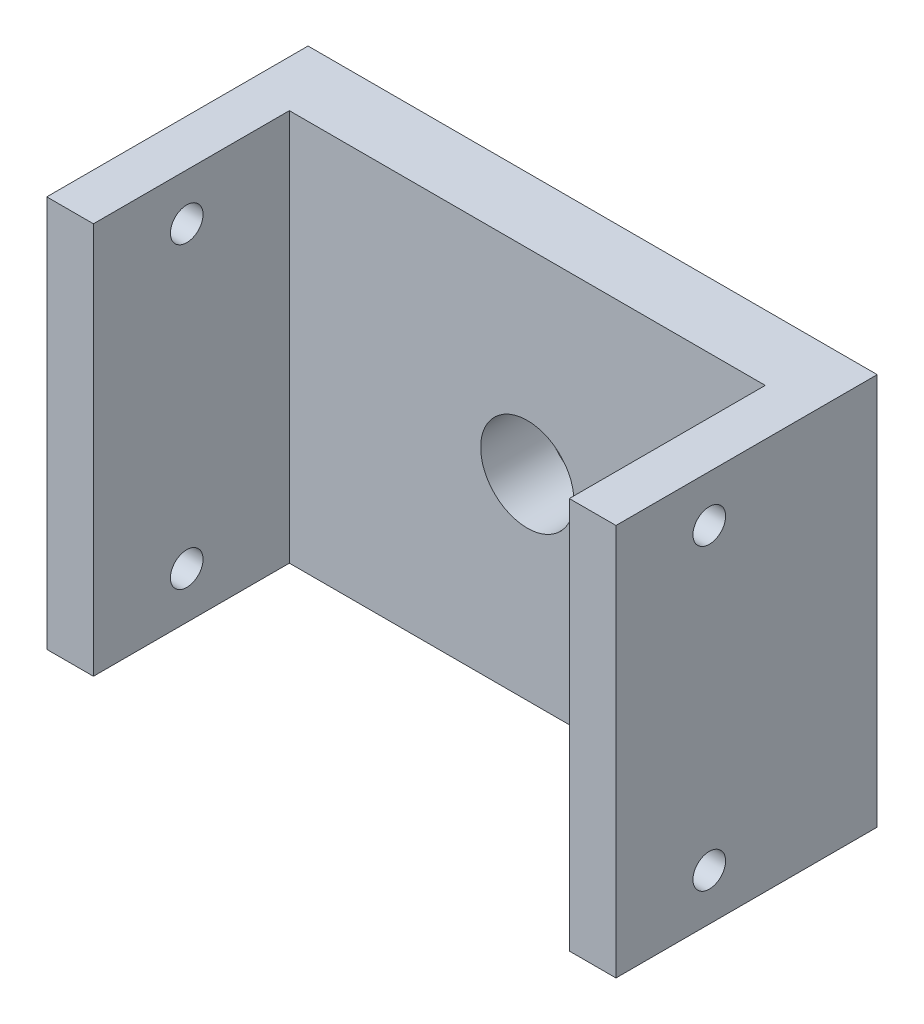
ISO-10303-21;
HEADER;
FILE_DESCRIPTION(('STEP AP214'),'2;1');
FILE_NAME('part.step','',(''),(''),'','','');
FILE_SCHEMA(('AUTOMOTIVE_DESIGN { 1 0 10303 214 1 1 1 1 }'));
ENDSEC;
DATA;
#1=APPLICATION_CONTEXT('core data for automotive mechanical design processes');
#2=APPLICATION_PROTOCOL_DEFINITION('international standard','automotive_design',2000,#1);
#3=PRODUCT_CONTEXT('',#1,'mechanical');
#4=PRODUCT('Part','Part','',(#3));
#5=PRODUCT_RELATED_PRODUCT_CATEGORY('part','',(#4));
#6=PRODUCT_DEFINITION_FORMATION('','',#4);
#7=PRODUCT_DEFINITION_CONTEXT('part definition',#1,'design');
#8=PRODUCT_DEFINITION('design','',#6,#7);
#9=PRODUCT_DEFINITION_SHAPE('','',#8);
#10=(LENGTH_UNIT() NAMED_UNIT(*) SI_UNIT(.MILLI.,.METRE.));
#11=(NAMED_UNIT(*) PLANE_ANGLE_UNIT() SI_UNIT($,.RADIAN.));
#12=(NAMED_UNIT(*) SI_UNIT($,.STERADIAN.) SOLID_ANGLE_UNIT());
#13=UNCERTAINTY_MEASURE_WITH_UNIT(LENGTH_MEASURE(1.E-05),#10,'distance_accuracy_value','');
#14=(GEOMETRIC_REPRESENTATION_CONTEXT(3) GLOBAL_UNCERTAINTY_ASSIGNED_CONTEXT((#13)) GLOBAL_UNIT_ASSIGNED_CONTEXT((#10,
#11,#12)) REPRESENTATION_CONTEXT('',''));
#15=CARTESIAN_POINT('',(0.,0.,0.));
#16=DIRECTION('',(0.,0.,1.));
#17=DIRECTION('',(1.,0.,0.));
#18=AXIS2_PLACEMENT_3D('',#15,#16,#17);
#19=CARTESIAN_POINT('',(0.,0.,7.));
#20=DIRECTION('',(0.,0.,1.));
#21=DIRECTION('',(1.,0.,0.));
#22=AXIS2_PLACEMENT_3D('',#19,#20,#21);
#23=PLANE('',#22);
#24=CARTESIAN_POINT('',(0.,0.,7.));
#25=DIRECTION('',(0.,0.,1.));
#26=DIRECTION('',(1.,0.,0.));
#27=AXIS2_PLACEMENT_3D('',#24,#25,#26);
#28=CIRCLE('',#27,5.);
#29=CARTESIAN_POINT('',(4.99999999999999,0.,7.));
#30=VERTEX_POINT('',#29);
#31=EDGE_CURVE('E141',#30,#30,#28,.T.);
#32=ORIENTED_EDGE('',*,*,#31,.F.);
#33=EDGE_LOOP('',(#32));
#34=FACE_BOUND('',#33,.T.);
#35=DIRECTION('',(1.,0.,0.));
#36=VECTOR('',#35,1.);
#37=CARTESIAN_POINT('',(-30.5,-21.,7.));
#38=LINE('',#37,#36);
#39=CARTESIAN_POINT('',(-25.5,-21.,7.));
#40=VERTEX_POINT('',#39);
#41=CARTESIAN_POINT('',(25.5,-21.,7.));
#42=VERTEX_POINT('',#41);
#43=EDGE_CURVE('E55',#40,#42,#38,.T.);
#44=ORIENTED_EDGE('',*,*,#43,.T.);
#45=DIRECTION('',(0.,-1.,0.));
#46=VECTOR('',#45,1.);
#47=CARTESIAN_POINT('',(25.5,21.,7.));
#48=LINE('',#47,#46);
#49=CARTESIAN_POINT('',(25.5,21.,7.));
#50=VERTEX_POINT('',#49);
#51=EDGE_CURVE('E50',#50,#42,#48,.T.);
#52=ORIENTED_EDGE('',*,*,#51,.F.);
#53=DIRECTION('',(-1.,0.,0.));
#54=VECTOR('',#53,1.);
#55=CARTESIAN_POINT('',(-30.5,21.,7.));
#56=LINE('',#55,#54);
#57=CARTESIAN_POINT('',(-25.5,21.,7.));
#58=VERTEX_POINT('',#57);
#59=EDGE_CURVE('E120',#50,#58,#56,.T.);
#60=ORIENTED_EDGE('',*,*,#59,.T.);
#61=DIRECTION('',(0.,1.,0.));
#62=VECTOR('',#61,1.);
#63=CARTESIAN_POINT('',(-25.5,21.,7.));
#64=LINE('',#63,#62);
#65=EDGE_CURVE('E121',#40,#58,#64,.T.);
#66=ORIENTED_EDGE('',*,*,#65,.F.);
#67=EDGE_LOOP('',(#44,#52,#60,#66));
#68=FACE_BOUND('',#67,.T.);
#69=ADVANCED_FACE('F33',(#34,#68),#23,.T.);
#70=CARTESIAN_POINT('',(0.,0.,0.));
#71=DIRECTION('',(0.,0.,1.));
#72=DIRECTION('',(1.,0.,0.));
#73=AXIS2_PLACEMENT_3D('',#70,#71,#72);
#74=PLANE('',#73);
#75=DIRECTION('',(0.,1.,0.));
#76=VECTOR('',#75,1.);
#77=CARTESIAN_POINT('',(30.5,21.,0.));
#78=LINE('',#77,#76);
#79=CARTESIAN_POINT('',(30.5,-21.,0.));
#80=VERTEX_POINT('',#79);
#81=CARTESIAN_POINT('',(30.5,21.,0.));
#82=VERTEX_POINT('',#81);
#83=EDGE_CURVE('E161',#80,#82,#78,.T.);
#84=ORIENTED_EDGE('',*,*,#83,.F.);
#85=DIRECTION('',(1.,0.,0.));
#86=VECTOR('',#85,1.);
#87=CARTESIAN_POINT('',(-30.5,-21.,0.));
#88=LINE('',#87,#86);
#89=CARTESIAN_POINT('',(-30.5,-21.,0.));
#90=VERTEX_POINT('',#89);
#91=EDGE_CURVE('E156',#90,#80,#88,.T.);
#92=ORIENTED_EDGE('',*,*,#91,.F.);
#93=DIRECTION('',(0.,-1.,0.));
#94=VECTOR('',#93,1.);
#95=CARTESIAN_POINT('',(-30.5,21.,0.));
#96=LINE('',#95,#94);
#97=CARTESIAN_POINT('',(-30.5,21.,0.));
#98=VERTEX_POINT('',#97);
#99=EDGE_CURVE('E166',#98,#90,#96,.T.);
#100=ORIENTED_EDGE('',*,*,#99,.F.);
#101=DIRECTION('',(-1.,0.,0.));
#102=VECTOR('',#101,1.);
#103=CARTESIAN_POINT('',(-30.5,21.,0.));
#104=LINE('',#103,#102);
#105=EDGE_CURVE('E164',#82,#98,#104,.T.);
#106=ORIENTED_EDGE('',*,*,#105,.F.);
#107=EDGE_LOOP('',(#84,#92,#100,#106));
#108=FACE_BOUND('',#107,.T.);
#109=CARTESIAN_POINT('',(0.,0.,0.));
#110=DIRECTION('',(0.,0.,1.));
#111=DIRECTION('',(1.,0.,0.));
#112=AXIS2_PLACEMENT_3D('',#109,#110,#111);
#113=CIRCLE('',#112,5.);
#114=CARTESIAN_POINT('',(4.99999999999999,0.,0.));
#115=VERTEX_POINT('',#114);
#116=EDGE_CURVE('E152',#115,#115,#113,.T.);
#117=ORIENTED_EDGE('',*,*,#116,.T.);
#118=EDGE_LOOP('',(#117));
#119=FACE_BOUND('',#118,.T.);
#120=ADVANCED_FACE('F184',(#108,#119),#74,.F.);
#121=CARTESIAN_POINT('',(30.5,21.,7.));
#122=DIRECTION('',(-1.,0.,0.));
#123=DIRECTION('',(0.,-1.,0.));
#124=AXIS2_PLACEMENT_3D('',#121,#122,#123);
#125=PLANE('',#124);
#126=CARTESIAN_POINT('',(30.5,-16.,18.));
#127=DIRECTION('',(1.,0.,0.));
#128=DIRECTION('',(0.,-1.,0.));
#129=AXIS2_PLACEMENT_3D('',#126,#127,#128);
#130=CIRCLE('',#129,1.75);
#131=CARTESIAN_POINT('',(30.5,-17.75,18.));
#132=VERTEX_POINT('',#131);
#133=EDGE_CURVE('E208',#132,#132,#130,.T.);
#134=ORIENTED_EDGE('',*,*,#133,.F.);
#135=EDGE_LOOP('',(#134));
#136=FACE_BOUND('',#135,.T.);
#137=CARTESIAN_POINT('',(30.5,16.,18.));
#138=DIRECTION('',(1.,0.,0.));
#139=DIRECTION('',(0.,1.,0.));
#140=AXIS2_PLACEMENT_3D('',#137,#138,#139);
#141=CIRCLE('',#140,1.75);
#142=CARTESIAN_POINT('',(30.5,17.75,18.));
#143=VERTEX_POINT('',#142);
#144=EDGE_CURVE('E200',#143,#143,#141,.T.);
#145=ORIENTED_EDGE('',*,*,#144,.F.);
#146=EDGE_LOOP('',(#145));
#147=FACE_BOUND('',#146,.T.);
#148=ORIENTED_EDGE('',*,*,#83,.T.);
#149=DIRECTION('',(0.,0.,-1.));
#150=VECTOR('',#149,1.);
#151=CARTESIAN_POINT('',(30.5,21.,7.));
#152=LINE('',#151,#150);
#153=CARTESIAN_POINT('',(30.5,21.,28.));
#154=VERTEX_POINT('',#153);
#155=EDGE_CURVE('E11',#154,#82,#152,.T.);
#156=ORIENTED_EDGE('',*,*,#155,.F.);
#157=DIRECTION('',(0.,1.,0.));
#158=VECTOR('',#157,1.);
#159=CARTESIAN_POINT('',(30.5,21.,28.));
#160=LINE('',#159,#158);
#161=CARTESIAN_POINT('',(30.5,-21.,28.));
#162=VERTEX_POINT('',#161);
#163=EDGE_CURVE('E115',#162,#154,#160,.T.);
#164=ORIENTED_EDGE('',*,*,#163,.F.);
#165=DIRECTION('',(0.,0.,-1.));
#166=VECTOR('',#165,1.);
#167=CARTESIAN_POINT('',(30.5,-21.,7.));
#168=LINE('',#167,#166);
#169=EDGE_CURVE('E169',#162,#80,#168,.T.);
#170=ORIENTED_EDGE('',*,*,#169,.T.);
#171=EDGE_LOOP('',(#148,#156,#164,#170));
#172=FACE_BOUND('',#171,.T.);
#173=ADVANCED_FACE('F35',(#136,#147,#172),#125,.F.);
#174=CARTESIAN_POINT('',(-30.5,21.,7.));
#175=DIRECTION('',(0.,-1.,0.));
#176=DIRECTION('',(0.,0.,-1.));
#177=AXIS2_PLACEMENT_3D('',#174,#175,#176);
#178=PLANE('',#177);
#179=ORIENTED_EDGE('',*,*,#105,.T.);
#180=DIRECTION('',(0.,0.,-1.));
#181=VECTOR('',#180,1.);
#182=CARTESIAN_POINT('',(-30.5,21.,7.));
#183=LINE('',#182,#181);
#184=CARTESIAN_POINT('',(-30.5,21.,28.));
#185=VERTEX_POINT('',#184);
#186=EDGE_CURVE('E42',#185,#98,#183,.T.);
#187=ORIENTED_EDGE('',*,*,#186,.F.);
#188=DIRECTION('',(-1.,0.,0.));
#189=VECTOR('',#188,1.);
#190=CARTESIAN_POINT('',(-30.5,21.,28.));
#191=LINE('',#190,#189);
#192=CARTESIAN_POINT('',(-25.5,21.,28.));
#193=VERTEX_POINT('',#192);
#194=EDGE_CURVE('E135',#193,#185,#191,.T.);
#195=ORIENTED_EDGE('',*,*,#194,.F.);
#196=DIRECTION('',(0.,0.,-1.));
#197=VECTOR('',#196,1.);
#198=CARTESIAN_POINT('',(-25.5,21.,28.));
#199=LINE('',#198,#197);
#200=EDGE_CURVE('E138',#193,#58,#199,.T.);
#201=ORIENTED_EDGE('',*,*,#200,.T.);
#202=ORIENTED_EDGE('',*,*,#59,.F.);
#203=DIRECTION('',(0.,0.,-1.));
#204=VECTOR('',#203,1.);
#205=CARTESIAN_POINT('',(25.5,21.,28.));
#206=LINE('',#205,#204);
#207=CARTESIAN_POINT('',(25.5,21.,28.));
#208=VERTEX_POINT('',#207);
#209=EDGE_CURVE('E102',#208,#50,#206,.T.);
#210=ORIENTED_EDGE('',*,*,#209,.F.);
#211=DIRECTION('',(-1.,0.,0.));
#212=VECTOR('',#211,1.);
#213=CARTESIAN_POINT('',(30.5,21.,28.));
#214=LINE('',#213,#212);
#215=EDGE_CURVE('E109',#154,#208,#214,.T.);
#216=ORIENTED_EDGE('',*,*,#215,.F.);
#217=ORIENTED_EDGE('',*,*,#155,.T.);
#218=EDGE_LOOP('',(#179,#187,#195,#201,#202,#210,#216,#217));
#219=FACE_BOUND('',#218,.T.);
#220=ADVANCED_FACE('F118',(#219),#178,.F.);
#221=CARTESIAN_POINT('',(-30.5,21.,7.));
#222=DIRECTION('',(1.,0.,0.));
#223=DIRECTION('',(0.,1.,0.));
#224=AXIS2_PLACEMENT_3D('',#221,#222,#223);
#225=PLANE('',#224);
#226=CARTESIAN_POINT('',(-30.5,-16.,18.));
#227=DIRECTION('',(1.,0.,0.));
#228=DIRECTION('',(0.,-1.,0.));
#229=AXIS2_PLACEMENT_3D('',#226,#227,#228);
#230=CIRCLE('',#229,1.75);
#231=CARTESIAN_POINT('',(-30.5,-17.75,18.));
#232=VERTEX_POINT('',#231);
#233=EDGE_CURVE('E211',#232,#232,#230,.T.);
#234=ORIENTED_EDGE('',*,*,#233,.T.);
#235=EDGE_LOOP('',(#234));
#236=FACE_BOUND('',#235,.T.);
#237=CARTESIAN_POINT('',(-30.5,16.,18.));
#238=DIRECTION('',(1.,0.,0.));
#239=DIRECTION('',(0.,1.,0.));
#240=AXIS2_PLACEMENT_3D('',#237,#238,#239);
#241=CIRCLE('',#240,1.75);
#242=CARTESIAN_POINT('',(-30.5,17.75,18.));
#243=VERTEX_POINT('',#242);
#244=EDGE_CURVE('E198',#243,#243,#241,.T.);
#245=ORIENTED_EDGE('',*,*,#244,.T.);
#246=EDGE_LOOP('',(#245));
#247=FACE_BOUND('',#246,.T.);
#248=ORIENTED_EDGE('',*,*,#99,.T.);
#249=DIRECTION('',(0.,0.,-1.));
#250=VECTOR('',#249,1.);
#251=CARTESIAN_POINT('',(-30.5,-21.,7.));
#252=LINE('',#251,#250);
#253=CARTESIAN_POINT('',(-30.5,-21.,28.));
#254=VERTEX_POINT('',#253);
#255=EDGE_CURVE('E172',#254,#90,#252,.T.);
#256=ORIENTED_EDGE('',*,*,#255,.F.);
#257=DIRECTION('',(0.,-1.,0.));
#258=VECTOR('',#257,1.);
#259=CARTESIAN_POINT('',(-30.5,21.,28.));
#260=LINE('',#259,#258);
#261=EDGE_CURVE('E124',#185,#254,#260,.T.);
#262=ORIENTED_EDGE('',*,*,#261,.F.);
#263=ORIENTED_EDGE('',*,*,#186,.T.);
#264=EDGE_LOOP('',(#248,#256,#262,#263));
#265=FACE_BOUND('',#264,.T.);
#266=ADVANCED_FACE('F179',(#236,#247,#265),#225,.F.);
#267=CARTESIAN_POINT('',(-30.5,-21.,7.));
#268=DIRECTION('',(0.,1.,0.));
#269=DIRECTION('',(0.,0.,1.));
#270=AXIS2_PLACEMENT_3D('',#267,#268,#269);
#271=PLANE('',#270);
#272=ORIENTED_EDGE('',*,*,#91,.T.);
#273=ORIENTED_EDGE('',*,*,#169,.F.);
#274=DIRECTION('',(1.,0.,0.));
#275=VECTOR('',#274,1.);
#276=CARTESIAN_POINT('',(30.5,-21.,28.));
#277=LINE('',#276,#275);
#278=CARTESIAN_POINT('',(25.5,-21.,28.));
#279=VERTEX_POINT('',#278);
#280=EDGE_CURVE('E108',#279,#162,#277,.T.);
#281=ORIENTED_EDGE('',*,*,#280,.F.);
#282=DIRECTION('',(0.,0.,-1.));
#283=VECTOR('',#282,1.);
#284=CARTESIAN_POINT('',(25.5,-21.,28.));
#285=LINE('',#284,#283);
#286=EDGE_CURVE('E104',#279,#42,#285,.T.);
#287=ORIENTED_EDGE('',*,*,#286,.T.);
#288=ORIENTED_EDGE('',*,*,#43,.F.);
#289=DIRECTION('',(0.,0.,-1.));
#290=VECTOR('',#289,1.);
#291=CARTESIAN_POINT('',(-25.5,-21.,28.));
#292=LINE('',#291,#290);
#293=CARTESIAN_POINT('',(-25.5,-21.,28.));
#294=VERTEX_POINT('',#293);
#295=EDGE_CURVE('E147',#294,#40,#292,.T.);
#296=ORIENTED_EDGE('',*,*,#295,.F.);
#297=DIRECTION('',(1.,0.,0.));
#298=VECTOR('',#297,1.);
#299=CARTESIAN_POINT('',(-30.5,-21.,28.));
#300=LINE('',#299,#298);
#301=EDGE_CURVE('E131',#254,#294,#300,.T.);
#302=ORIENTED_EDGE('',*,*,#301,.F.);
#303=ORIENTED_EDGE('',*,*,#255,.T.);
#304=EDGE_LOOP('',(#272,#273,#281,#287,#288,#296,#302,#303));
#305=FACE_BOUND('',#304,.T.);
#306=ADVANCED_FACE('F187',(#305),#271,.F.);
#307=CARTESIAN_POINT('',(0.,0.,7.));
#308=DIRECTION('',(0.,0.,-1.));
#309=DIRECTION('',(-1.,0.,0.));
#310=AXIS2_PLACEMENT_3D('',#307,#308,#309);
#311=CYLINDRICAL_SURFACE('',#310,5.);
#312=ORIENTED_EDGE('',*,*,#31,.T.);
#313=EDGE_LOOP('',(#312));
#314=FACE_BOUND('',#313,.T.);
#315=ORIENTED_EDGE('',*,*,#116,.F.);
#316=EDGE_LOOP('',(#315));
#317=FACE_BOUND('',#316,.T.);
#318=ADVANCED_FACE('F243',(#314,#317),#311,.F.);
#319=CARTESIAN_POINT('',(-25.5,21.,28.));
#320=DIRECTION('',(-1.,0.,0.));
#321=DIRECTION('',(0.,-1.,0.));
#322=AXIS2_PLACEMENT_3D('',#319,#320,#321);
#323=PLANE('',#322);
#324=CARTESIAN_POINT('',(-25.5,-16.,18.));
#325=DIRECTION('',(-1.,0.,0.));
#326=DIRECTION('',(0.,-1.,0.));
#327=AXIS2_PLACEMENT_3D('',#324,#325,#326);
#328=CIRCLE('',#327,1.75);
#329=CARTESIAN_POINT('',(-25.5,-17.75,18.));
#330=VERTEX_POINT('',#329);
#331=EDGE_CURVE('E203',#330,#330,#328,.T.);
#332=ORIENTED_EDGE('',*,*,#331,.T.);
#333=EDGE_LOOP('',(#332));
#334=FACE_BOUND('',#333,.T.);
#335=CARTESIAN_POINT('',(-25.5,16.,18.));
#336=DIRECTION('',(-1.,0.,0.));
#337=DIRECTION('',(0.,-1.,0.));
#338=AXIS2_PLACEMENT_3D('',#335,#336,#337);
#339=CIRCLE('',#338,1.75);
#340=CARTESIAN_POINT('',(-25.5,14.25,18.));
#341=VERTEX_POINT('',#340);
#342=EDGE_CURVE('E192',#341,#341,#339,.T.);
#343=ORIENTED_EDGE('',*,*,#342,.T.);
#344=EDGE_LOOP('',(#343));
#345=FACE_BOUND('',#344,.T.);
#346=ORIENTED_EDGE('',*,*,#65,.T.);
#347=ORIENTED_EDGE('',*,*,#200,.F.);
#348=DIRECTION('',(0.,1.,0.));
#349=VECTOR('',#348,1.);
#350=CARTESIAN_POINT('',(-25.5,21.,28.));
#351=LINE('',#350,#349);
#352=EDGE_CURVE('E133',#294,#193,#351,.T.);
#353=ORIENTED_EDGE('',*,*,#352,.F.);
#354=ORIENTED_EDGE('',*,*,#295,.T.);
#355=EDGE_LOOP('',(#346,#347,#353,#354));
#356=FACE_BOUND('',#355,.T.);
#357=ADVANCED_FACE('F271',(#334,#345,#356),#323,.F.);
#358=CARTESIAN_POINT('',(0.,0.,28.));
#359=DIRECTION('',(0.,0.,1.));
#360=DIRECTION('',(1.,0.,0.));
#361=AXIS2_PLACEMENT_3D('',#358,#359,#360);
#362=PLANE('',#361);
#363=ORIENTED_EDGE('',*,*,#261,.T.);
#364=ORIENTED_EDGE('',*,*,#301,.T.);
#365=ORIENTED_EDGE('',*,*,#352,.T.);
#366=ORIENTED_EDGE('',*,*,#194,.T.);
#367=EDGE_LOOP('',(#363,#364,#365,#366));
#368=FACE_BOUND('',#367,.T.);
#369=ADVANCED_FACE('F264',(#368),#362,.T.);
#370=CARTESIAN_POINT('',(25.5,21.,28.));
#371=DIRECTION('',(1.,0.,0.));
#372=DIRECTION('',(0.,0.,-1.));
#373=AXIS2_PLACEMENT_3D('',#370,#371,#372);
#374=PLANE('',#373);
#375=CARTESIAN_POINT('',(25.5,-16.,18.));
#376=DIRECTION('',(1.,0.,0.));
#377=DIRECTION('',(0.,0.,-1.));
#378=AXIS2_PLACEMENT_3D('',#375,#376,#377);
#379=CIRCLE('',#378,1.75);
#380=CARTESIAN_POINT('',(25.5,-16.,16.25));
#381=VERTEX_POINT('',#380);
#382=EDGE_CURVE('E37',#381,#381,#379,.T.);
#383=ORIENTED_EDGE('',*,*,#382,.T.);
#384=EDGE_LOOP('',(#383));
#385=FACE_BOUND('',#384,.T.);
#386=CARTESIAN_POINT('',(25.5,16.,18.));
#387=DIRECTION('',(1.,0.,0.));
#388=DIRECTION('',(0.,0.,-1.));
#389=AXIS2_PLACEMENT_3D('',#386,#387,#388);
#390=CIRCLE('',#389,1.75);
#391=CARTESIAN_POINT('',(25.5,16.,16.25));
#392=VERTEX_POINT('',#391);
#393=EDGE_CURVE('E157',#392,#392,#390,.T.);
#394=ORIENTED_EDGE('',*,*,#393,.T.);
#395=EDGE_LOOP('',(#394));
#396=FACE_BOUND('',#395,.T.);
#397=ORIENTED_EDGE('',*,*,#51,.T.);
#398=ORIENTED_EDGE('',*,*,#286,.F.);
#399=DIRECTION('',(0.,-1.,0.));
#400=VECTOR('',#399,1.);
#401=CARTESIAN_POINT('',(25.5,21.,28.));
#402=LINE('',#401,#400);
#403=EDGE_CURVE('E98',#208,#279,#402,.T.);
#404=ORIENTED_EDGE('',*,*,#403,.F.);
#405=ORIENTED_EDGE('',*,*,#209,.T.);
#406=EDGE_LOOP('',(#397,#398,#404,#405));
#407=FACE_BOUND('',#406,.T.);
#408=ADVANCED_FACE('F100',(#385,#396,#407),#374,.F.);
#409=CARTESIAN_POINT('',(0.,0.,28.));
#410=DIRECTION('',(0.,0.,1.));
#411=DIRECTION('',(1.,0.,0.));
#412=AXIS2_PLACEMENT_3D('',#409,#410,#411);
#413=PLANE('',#412);
#414=ORIENTED_EDGE('',*,*,#215,.T.);
#415=ORIENTED_EDGE('',*,*,#403,.T.);
#416=ORIENTED_EDGE('',*,*,#280,.T.);
#417=ORIENTED_EDGE('',*,*,#163,.T.);
#418=EDGE_LOOP('',(#414,#415,#416,#417));
#419=FACE_BOUND('',#418,.T.);
#420=ADVANCED_FACE('F113',(#419),#413,.T.);
#421=CARTESIAN_POINT('',(-30.5,16.,18.));
#422=DIRECTION('',(1.,0.,0.));
#423=DIRECTION('',(0.,1.,0.));
#424=AXIS2_PLACEMENT_3D('',#421,#422,#423);
#425=CYLINDRICAL_SURFACE('',#424,1.75);
#426=ORIENTED_EDGE('',*,*,#144,.T.);
#427=EDGE_LOOP('',(#426));
#428=FACE_BOUND('',#427,.T.);
#429=ORIENTED_EDGE('',*,*,#393,.F.);
#430=EDGE_LOOP('',(#429));
#431=FACE_BOUND('',#430,.T.);
#432=ADVANCED_FACE('F231',(#428,#431),#425,.F.);
#433=ORIENTED_EDGE('',*,*,#244,.F.);
#434=EDGE_LOOP('',(#433));
#435=FACE_BOUND('',#434,.T.);
#436=ORIENTED_EDGE('',*,*,#342,.F.);
#437=EDGE_LOOP('',(#436));
#438=FACE_BOUND('',#437,.T.);
#439=ADVANCED_FACE('F223',(#435,#438),#425,.F.);
#440=CARTESIAN_POINT('',(-30.5,-16.,18.));
#441=DIRECTION('',(1.,0.,0.));
#442=DIRECTION('',(0.,1.,0.));
#443=AXIS2_PLACEMENT_3D('',#440,#441,#442);
#444=CYLINDRICAL_SURFACE('',#443,1.75);
#445=ORIENTED_EDGE('',*,*,#133,.T.);
#446=EDGE_LOOP('',(#445));
#447=FACE_BOUND('',#446,.T.);
#448=ORIENTED_EDGE('',*,*,#382,.F.);
#449=EDGE_LOOP('',(#448));
#450=FACE_BOUND('',#449,.T.);
#451=ADVANCED_FACE('F220',(#447,#450),#444,.F.);
#452=ORIENTED_EDGE('',*,*,#233,.F.);
#453=EDGE_LOOP('',(#452));
#454=FACE_BOUND('',#453,.T.);
#455=ORIENTED_EDGE('',*,*,#331,.F.);
#456=EDGE_LOOP('',(#455));
#457=FACE_BOUND('',#456,.T.);
#458=ADVANCED_FACE('F222',(#454,#457),#444,.F.);
#459=CLOSED_SHELL('',(#69,#120,#173,#220,#266,#306,#318,#357,#369,#408,#420,#432,#439,#451,#458));
#460=MANIFOLD_SOLID_BREP('B2',#459);
#461=ADVANCED_BREP_SHAPE_REPRESENTATION('',(#18,#460),#14);
#462=SHAPE_DEFINITION_REPRESENTATION(#9,#461);
ENDSEC;
END-ISO-10303-21;
